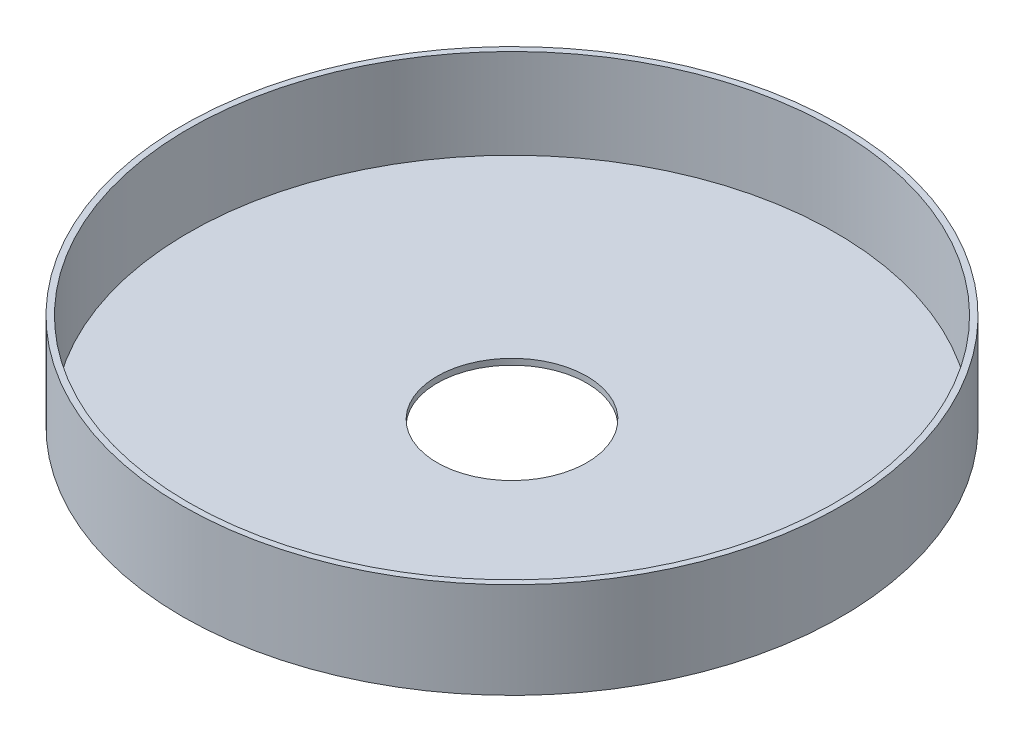
ISO-10303-21;
HEADER;
FILE_DESCRIPTION(('STEP AP214'),'2;1');
FILE_NAME('part.step','',(''),(''),'','','');
FILE_SCHEMA(('AUTOMOTIVE_DESIGN { 1 0 10303 214 1 1 1 1 }'));
ENDSEC;
DATA;
#1=APPLICATION_CONTEXT('core data for automotive mechanical design processes');
#2=APPLICATION_PROTOCOL_DEFINITION('international standard','automotive_design',2000,#1);
#3=PRODUCT_CONTEXT('',#1,'mechanical');
#4=PRODUCT('Part','Part','',(#3));
#5=PRODUCT_RELATED_PRODUCT_CATEGORY('part','',(#4));
#6=PRODUCT_DEFINITION_FORMATION('','',#4);
#7=PRODUCT_DEFINITION_CONTEXT('part definition',#1,'design');
#8=PRODUCT_DEFINITION('design','',#6,#7);
#9=PRODUCT_DEFINITION_SHAPE('','',#8);
#10=(LENGTH_UNIT() NAMED_UNIT(*) SI_UNIT(.MILLI.,.METRE.));
#11=(NAMED_UNIT(*) PLANE_ANGLE_UNIT() SI_UNIT($,.RADIAN.));
#12=(NAMED_UNIT(*) SI_UNIT($,.STERADIAN.) SOLID_ANGLE_UNIT());
#13=UNCERTAINTY_MEASURE_WITH_UNIT(LENGTH_MEASURE(1.E-05),#10,'distance_accuracy_value','');
#14=(GEOMETRIC_REPRESENTATION_CONTEXT(3) GLOBAL_UNCERTAINTY_ASSIGNED_CONTEXT((#13)) GLOBAL_UNIT_ASSIGNED_CONTEXT((#10,
#11,#12)) REPRESENTATION_CONTEXT('',''));
#15=CARTESIAN_POINT('',(0.,0.,0.));
#16=DIRECTION('',(0.,0.,1.));
#17=DIRECTION('',(1.,0.,0.));
#18=AXIS2_PLACEMENT_3D('',#15,#16,#17);
#19=CARTESIAN_POINT('',(0.,15.,0.));
#20=DIRECTION('',(0.,1.,0.));
#21=DIRECTION('',(0.,0.,1.));
#22=AXIS2_PLACEMENT_3D('',#19,#20,#21);
#23=PLANE('',#22);
#24=CARTESIAN_POINT('',(0.,15.,0.));
#25=DIRECTION('',(0.,1.,0.));
#26=DIRECTION('',(0.,0.,1.));
#27=AXIS2_PLACEMENT_3D('',#24,#25,#26);
#28=CIRCLE('',#27,55.);
#29=CARTESIAN_POINT('',(0.,15.,55.));
#30=VERTEX_POINT('',#29);
#31=EDGE_CURVE('E10',#30,#30,#28,.T.);
#32=ORIENTED_EDGE('',*,*,#31,.T.);
#33=EDGE_LOOP('',(#32));
#34=FACE_BOUND('',#33,.T.);
#35=CARTESIAN_POINT('',(0.,15.,0.));
#36=DIRECTION('',(0.,1.,0.));
#37=DIRECTION('',(0.,0.,1.));
#38=AXIS2_PLACEMENT_3D('',#35,#36,#37);
#39=CIRCLE('',#38,54.);
#40=CARTESIAN_POINT('',(0.,15.,54.));
#41=VERTEX_POINT('',#40);
#42=EDGE_CURVE('E45',#41,#41,#39,.T.);
#43=ORIENTED_EDGE('',*,*,#42,.F.);
#44=EDGE_LOOP('',(#43));
#45=FACE_BOUND('',#44,.T.);
#46=ADVANCED_FACE('F37',(#34,#45),#23,.T.);
#47=CARTESIAN_POINT('',(0.,15.,0.));
#48=DIRECTION('',(0.,-1.,0.));
#49=DIRECTION('',(0.,0.,-1.));
#50=AXIS2_PLACEMENT_3D('',#47,#48,#49);
#51=CYLINDRICAL_SURFACE('',#50,55.);
#52=ORIENTED_EDGE('',*,*,#31,.F.);
#53=EDGE_LOOP('',(#52));
#54=FACE_BOUND('',#53,.T.);
#55=CARTESIAN_POINT('',(0.,-1.,0.));
#56=DIRECTION('',(0.,-1.,0.));
#57=DIRECTION('',(0.,0.,-1.));
#58=AXIS2_PLACEMENT_3D('',#55,#56,#57);
#59=CIRCLE('',#58,55.);
#60=CARTESIAN_POINT('',(0.,-1.,-55.));
#61=VERTEX_POINT('',#60);
#62=EDGE_CURVE('E56',#61,#61,#59,.T.);
#63=ORIENTED_EDGE('',*,*,#62,.F.);
#64=EDGE_LOOP('',(#63));
#65=FACE_BOUND('',#64,.T.);
#66=ADVANCED_FACE('F39',(#54,#65),#51,.T.);
#67=CARTESIAN_POINT('',(0.,15.,0.));
#68=DIRECTION('',(0.,-1.,0.));
#69=DIRECTION('',(0.,0.,-1.));
#70=AXIS2_PLACEMENT_3D('',#67,#68,#69);
#71=CYLINDRICAL_SURFACE('',#70,54.);
#72=ORIENTED_EDGE('',*,*,#42,.T.);
#73=EDGE_LOOP('',(#72));
#74=FACE_BOUND('',#73,.T.);
#75=CARTESIAN_POINT('',(0.,0.,0.));
#76=DIRECTION('',(0.,1.,0.));
#77=DIRECTION('',(0.,0.,1.));
#78=AXIS2_PLACEMENT_3D('',#75,#76,#77);
#79=CIRCLE('',#78,54.);
#80=CARTESIAN_POINT('',(0.,0.,54.));
#81=VERTEX_POINT('',#80);
#82=EDGE_CURVE('E50',#81,#81,#79,.T.);
#83=ORIENTED_EDGE('',*,*,#82,.F.);
#84=EDGE_LOOP('',(#83));
#85=FACE_BOUND('',#84,.T.);
#86=ADVANCED_FACE('F83',(#74,#85),#71,.F.);
#87=CARTESIAN_POINT('',(0.,0.,0.));
#88=DIRECTION('',(0.,-1.,0.));
#89=DIRECTION('',(0.,0.,-1.));
#90=AXIS2_PLACEMENT_3D('',#87,#88,#89);
#91=PLANE('',#90);
#92=CARTESIAN_POINT('',(0.,0.,0.));
#93=DIRECTION('',(0.,-1.,0.));
#94=DIRECTION('',(0.,0.,-1.));
#95=AXIS2_PLACEMENT_3D('',#92,#93,#94);
#96=CIRCLE('',#95,12.5);
#97=CARTESIAN_POINT('',(0.,0.,-12.5));
#98=VERTEX_POINT('',#97);
#99=EDGE_CURVE('E62',#98,#98,#96,.T.);
#100=ORIENTED_EDGE('',*,*,#99,.T.);
#101=EDGE_LOOP('',(#100));
#102=FACE_BOUND('',#101,.T.);
#103=ORIENTED_EDGE('',*,*,#82,.T.);
#104=EDGE_LOOP('',(#103));
#105=FACE_BOUND('',#104,.T.);
#106=ADVANCED_FACE('F75',(#102,#105),#91,.F.);
#107=CARTESIAN_POINT('',(0.,-1.,0.));
#108=DIRECTION('',(0.,-1.,0.));
#109=DIRECTION('',(0.,0.,-1.));
#110=AXIS2_PLACEMENT_3D('',#107,#108,#109);
#111=PLANE('',#110);
#112=ORIENTED_EDGE('',*,*,#62,.T.);
#113=EDGE_LOOP('',(#112));
#114=FACE_BOUND('',#113,.T.);
#115=CARTESIAN_POINT('',(0.,-1.,0.));
#116=DIRECTION('',(0.,-1.,0.));
#117=DIRECTION('',(0.,0.,-1.));
#118=AXIS2_PLACEMENT_3D('',#115,#116,#117);
#119=CIRCLE('',#118,12.5);
#120=CARTESIAN_POINT('',(0.,-1.,-12.5));
#121=VERTEX_POINT('',#120);
#122=EDGE_CURVE('E61',#121,#121,#119,.T.);
#123=ORIENTED_EDGE('',*,*,#122,.F.);
#124=EDGE_LOOP('',(#123));
#125=FACE_BOUND('',#124,.T.);
#126=ADVANCED_FACE('F73',(#114,#125),#111,.T.);
#127=CARTESIAN_POINT('',(0.,-1.,0.));
#128=DIRECTION('',(0.,1.,0.));
#129=DIRECTION('',(0.,0.,1.));
#130=AXIS2_PLACEMENT_3D('',#127,#128,#129);
#131=CYLINDRICAL_SURFACE('',#130,12.5);
#132=ORIENTED_EDGE('',*,*,#122,.T.);
#133=EDGE_LOOP('',(#132));
#134=FACE_BOUND('',#133,.T.);
#135=ORIENTED_EDGE('',*,*,#99,.F.);
#136=EDGE_LOOP('',(#135));
#137=FACE_BOUND('',#136,.T.);
#138=ADVANCED_FACE('F70',(#134,#137),#131,.F.);
#139=CLOSED_SHELL('',(#46,#66,#86,#106,#126,#138));
#140=MANIFOLD_SOLID_BREP('B2',#139);
#141=ADVANCED_BREP_SHAPE_REPRESENTATION('',(#18,#140),#14);
#142=SHAPE_DEFINITION_REPRESENTATION(#9,#141);
ENDSEC;
END-ISO-10303-21;
